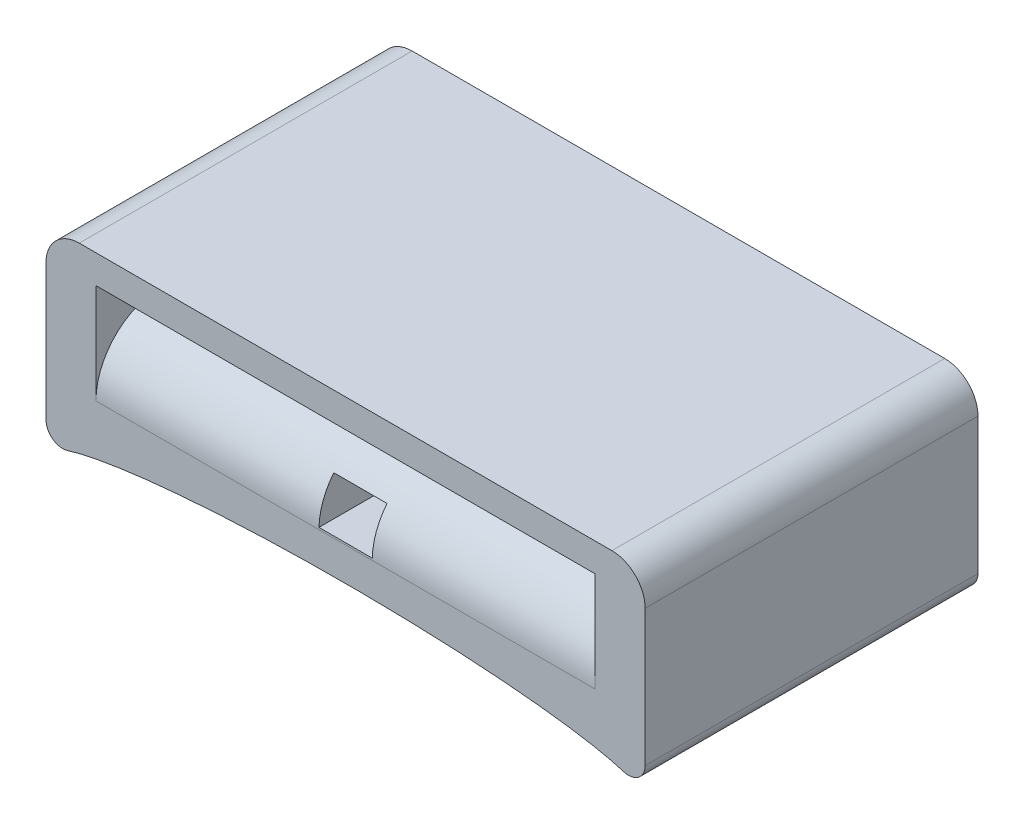
ISO-10303-21;
HEADER;
FILE_DESCRIPTION(('STEP AP214'),'2;1');
FILE_NAME('part.step','',(''),(''),'','','');
FILE_SCHEMA(('AUTOMOTIVE_DESIGN { 1 0 10303 214 1 1 1 1 }'));
ENDSEC;
DATA;
#1=APPLICATION_CONTEXT('core data for automotive mechanical design processes');
#2=APPLICATION_PROTOCOL_DEFINITION('international standard','automotive_design',2000,#1);
#3=PRODUCT_CONTEXT('',#1,'mechanical');
#4=PRODUCT('Part','Part','',(#3));
#5=PRODUCT_RELATED_PRODUCT_CATEGORY('part','',(#4));
#6=PRODUCT_DEFINITION_FORMATION('','',#4);
#7=PRODUCT_DEFINITION_CONTEXT('part definition',#1,'design');
#8=PRODUCT_DEFINITION('design','',#6,#7);
#9=PRODUCT_DEFINITION_SHAPE('','',#8);
#10=(LENGTH_UNIT() NAMED_UNIT(*) SI_UNIT(.MILLI.,.METRE.));
#11=(NAMED_UNIT(*) PLANE_ANGLE_UNIT() SI_UNIT($,.RADIAN.));
#12=(NAMED_UNIT(*) SI_UNIT($,.STERADIAN.) SOLID_ANGLE_UNIT());
#13=UNCERTAINTY_MEASURE_WITH_UNIT(LENGTH_MEASURE(1.E-05),#10,'distance_accuracy_value','');
#14=(GEOMETRIC_REPRESENTATION_CONTEXT(3) GLOBAL_UNCERTAINTY_ASSIGNED_CONTEXT((#13)) GLOBAL_UNIT_ASSIGNED_CONTEXT((#10,
#11,#12)) REPRESENTATION_CONTEXT('',''));
#15=CARTESIAN_POINT('',(0.,0.,0.));
#16=DIRECTION('',(0.,0.,1.));
#17=DIRECTION('',(1.,0.,0.));
#18=AXIS2_PLACEMENT_3D('',#15,#16,#17);
#19=CARTESIAN_POINT('',(-93.7271134300167,3.,36.0605939657694));
#20=DIRECTION('',(0.,0.,-1.));
#21=DIRECTION('',(-1.,0.,0.));
#22=AXIS2_PLACEMENT_3D('',#19,#20,#21);
#23=PLANE('',#22);
#24=DIRECTION('',(-1.,0.,0.));
#25=VECTOR('',#24,1.);
#26=CARTESIAN_POINT('',(-92.9771134300168,1.07272080045992,36.0605939657694));
#27=LINE('',#26,#25);
#28=CARTESIAN_POINT('',(-85.4771134300168,1.07272080045992,36.0605939657694));
#29=VERTEX_POINT('',#28);
#30=CARTESIAN_POINT('',(-92.9771134300168,1.07272080045992,36.0605939657694));
#31=VERTEX_POINT('',#30);
#32=EDGE_CURVE('E202',#29,#31,#27,.T.);
#33=ORIENTED_EDGE('',*,*,#32,.T.);
#34=DIRECTION('',(0.,1.,0.));
#35=VECTOR('',#34,1.);
#36=CARTESIAN_POINT('',(-92.9771134300168,0.,36.0605939657694));
#37=LINE('',#36,#35);
#38=CARTESIAN_POINT('',(-92.9771134300168,2.57272080045992,36.0605939657694));
#39=VERTEX_POINT('',#38);
#40=EDGE_CURVE('E65',#31,#39,#37,.T.);
#41=ORIENTED_EDGE('',*,*,#40,.T.);
#42=DIRECTION('',(-1.,0.,0.));
#43=VECTOR('',#42,1.);
#44=CARTESIAN_POINT('',(0.,2.57272080045992,36.0605939657694));
#45=LINE('',#44,#43);
#46=CARTESIAN_POINT('',(-85.4771134300168,2.57272080045992,36.0605939657694));
#47=VERTEX_POINT('',#46);
#48=EDGE_CURVE('E342',#47,#39,#45,.T.);
#49=ORIENTED_EDGE('',*,*,#48,.F.);
#50=DIRECTION('',(0.,1.,0.));
#51=VECTOR('',#50,1.);
#52=CARTESIAN_POINT('',(-85.4771134300168,0.,36.0605939657694));
#53=LINE('',#52,#51);
#54=EDGE_CURVE('E325',#29,#47,#53,.T.);
#55=ORIENTED_EDGE('',*,*,#54,.F.);
#56=EDGE_LOOP('',(#33,#41,#49,#55));
#57=FACE_BOUND('',#56,.T.);
#58=DIRECTION('',(1.,0.,0.));
#59=VECTOR('',#58,1.);
#60=CARTESIAN_POINT('',(-93.7271134300167,3.,36.0605939657694));
#61=LINE('',#60,#59);
#62=CARTESIAN_POINT('',(-93.2271134300167,3.,36.0605939657694));
#63=VERTEX_POINT('',#62);
#64=CARTESIAN_POINT('',(-85.2271134300168,3.,36.0605939657694));
#65=VERTEX_POINT('',#64);
#66=EDGE_CURVE('E407',#63,#65,#61,.T.);
#67=ORIENTED_EDGE('',*,*,#66,.F.);
#68=CARTESIAN_POINT('',(-93.2271134300167,2.5,36.0605939657694));
#69=DIRECTION('',(0.,0.,-1.));
#70=DIRECTION('',(-1.,0.,0.));
#71=AXIS2_PLACEMENT_3D('',#68,#69,#70);
#72=CIRCLE('',#71,0.5);
#73=CARTESIAN_POINT('',(-93.7271134300167,2.5,36.0605939657694));
#74=VERTEX_POINT('',#73);
#75=EDGE_CURVE('E370',#63,#74,#72,.F.);
#76=ORIENTED_EDGE('',*,*,#75,.T.);
#77=DIRECTION('',(0.,-1.,0.));
#78=VECTOR('',#77,1.);
#79=CARTESIAN_POINT('',(-93.7271134300167,3.,36.0605939657694));
#80=LINE('',#79,#78);
#81=CARTESIAN_POINT('',(-93.7271134300167,0.452186328997408,36.0605939657694));
#82=VERTEX_POINT('',#81);
#83=EDGE_CURVE('E400',#74,#82,#80,.T.);
#84=ORIENTED_EDGE('',*,*,#83,.T.);
#85=CARTESIAN_POINT('',(-93.4771134300167,0.452186328997408,36.0605939657694));
#86=DIRECTION('',(0.,0.,-1.));
#87=DIRECTION('',(-1.,0.,0.));
#88=AXIS2_PLACEMENT_3D('',#85,#86,#87);
#89=CIRCLE('',#88,0.25);
#90=CARTESIAN_POINT('',(-93.4017315918607,0.213821947270138,36.0605939657694));
#91=VERTEX_POINT('',#90);
#92=EDGE_CURVE('E429',#82,#91,#89,.F.);
#93=ORIENTED_EDGE('',*,*,#92,.T.);
#94=CARTESIAN_POINT('',(-89.2271134300167,0.,36.0605939657694));
#95=DIRECTION('',(0.,0.,1.));
#96=DIRECTION('',(1.,0.,0.));
#97=AXIS2_PLACEMENT_3D('',#94,#95,#96);
#98=ELLIPSE('',#97,4.49999999999999,0.572720800459922);
#99=CARTESIAN_POINT('',(-85.0524952681727,0.213821947270138,36.0605939657694));
#100=VERTEX_POINT('',#99);
#101=EDGE_CURVE('E263',#100,#91,#98,.T.);
#102=ORIENTED_EDGE('',*,*,#101,.F.);
#103=CARTESIAN_POINT('',(-84.9771134300168,0.452186328997408,36.0605939657694));
#104=DIRECTION('',(0.,0.,-1.));
#105=DIRECTION('',(-1.,0.,0.));
#106=AXIS2_PLACEMENT_3D('',#103,#104,#105);
#107=CIRCLE('',#106,0.25);
#108=CARTESIAN_POINT('',(-84.7271134300168,0.452186328997409,36.0605939657694));
#109=VERTEX_POINT('',#108);
#110=EDGE_CURVE('E397',#100,#109,#107,.F.);
#111=ORIENTED_EDGE('',*,*,#110,.T.);
#112=DIRECTION('',(0.,-1.,0.));
#113=VECTOR('',#112,1.);
#114=CARTESIAN_POINT('',(-84.7271134300168,3.,36.0605939657694));
#115=LINE('',#114,#113);
#116=CARTESIAN_POINT('',(-84.7271134300168,2.5,36.0605939657694));
#117=VERTEX_POINT('',#116);
#118=EDGE_CURVE('E389',#117,#109,#115,.T.);
#119=ORIENTED_EDGE('',*,*,#118,.F.);
#120=CARTESIAN_POINT('',(-85.2271134300168,2.5,36.0605939657694));
#121=DIRECTION('',(0.,0.,-1.));
#122=DIRECTION('',(-1.,0.,0.));
#123=AXIS2_PLACEMENT_3D('',#120,#121,#122);
#124=CIRCLE('',#123,0.5);
#125=EDGE_CURVE('E367',#117,#65,#124,.F.);
#126=ORIENTED_EDGE('',*,*,#125,.T.);
#127=EDGE_LOOP('',(#67,#76,#84,#93,#102,#111,#119,#126));
#128=FACE_BOUND('',#127,.T.);
#129=ADVANCED_FACE('F45',(#57,#128),#23,.F.);
#130=CARTESIAN_POINT('',(-93.7271134300167,3.,31.0605939657694));
#131=DIRECTION('',(0.,0.,1.));
#132=DIRECTION('',(1.,0.,0.));
#133=AXIS2_PLACEMENT_3D('',#130,#131,#132);
#134=PLANE('',#133);
#135=DIRECTION('',(0.,1.,0.));
#136=VECTOR('',#135,1.);
#137=CARTESIAN_POINT('',(-92.9771134300168,3.,31.0605939657694));
#138=LINE('',#137,#136);
#139=CARTESIAN_POINT('',(-92.9771134300168,1.07272080045992,31.0605939657694));
#140=VERTEX_POINT('',#139);
#141=CARTESIAN_POINT('',(-92.9771134300168,2.57272080045992,31.0605939657694));
#142=VERTEX_POINT('',#141);
#143=EDGE_CURVE('E180',#140,#142,#138,.T.);
#144=ORIENTED_EDGE('',*,*,#143,.F.);
#145=DIRECTION('',(-1.,0.,0.));
#146=VECTOR('',#145,1.);
#147=CARTESIAN_POINT('',(-85.4771134300168,1.07272080045992,31.0605939657694));
#148=LINE('',#147,#146);
#149=CARTESIAN_POINT('',(-85.4771134300168,1.07272080045992,31.0605939657694));
#150=VERTEX_POINT('',#149);
#151=EDGE_CURVE('E186',#140,#150,#148,.F.);
#152=ORIENTED_EDGE('',*,*,#151,.T.);
#153=DIRECTION('',(0.,1.,0.));
#154=VECTOR('',#153,1.);
#155=CARTESIAN_POINT('',(-85.4771134300168,3.,31.0605939657694));
#156=LINE('',#155,#154);
#157=CARTESIAN_POINT('',(-85.4771134300168,2.57272080045992,31.0605939657694));
#158=VERTEX_POINT('',#157);
#159=EDGE_CURVE('E190',#150,#158,#156,.T.);
#160=ORIENTED_EDGE('',*,*,#159,.T.);
#161=DIRECTION('',(-1.,0.,0.));
#162=VECTOR('',#161,1.);
#163=CARTESIAN_POINT('',(-93.7271134300167,2.57272080045992,31.0605939657694));
#164=LINE('',#163,#162);
#165=EDGE_CURVE('E188',#158,#142,#164,.T.);
#166=ORIENTED_EDGE('',*,*,#165,.T.);
#167=EDGE_LOOP('',(#144,#152,#160,#166));
#168=FACE_BOUND('',#167,.T.);
#169=DIRECTION('',(0.,-1.,0.));
#170=VECTOR('',#169,1.);
#171=CARTESIAN_POINT('',(-93.7271134300167,3.,31.0605939657694));
#172=LINE('',#171,#170);
#173=CARTESIAN_POINT('',(-93.7271134300167,2.5,31.0605939657694));
#174=VERTEX_POINT('',#173);
#175=CARTESIAN_POINT('',(-93.7271134300167,0.452186328997408,31.0605939657694));
#176=VERTEX_POINT('',#175);
#177=EDGE_CURVE('E411',#174,#176,#172,.T.);
#178=ORIENTED_EDGE('',*,*,#177,.F.);
#179=CARTESIAN_POINT('',(-93.2271134300167,2.5,31.0605939657694));
#180=DIRECTION('',(0.,0.,1.));
#181=DIRECTION('',(1.,0.,0.));
#182=AXIS2_PLACEMENT_3D('',#179,#180,#181);
#183=CIRCLE('',#182,0.5);
#184=CARTESIAN_POINT('',(-93.2271134300167,3.,31.0605939657694));
#185=VERTEX_POINT('',#184);
#186=EDGE_CURVE('E379',#174,#185,#183,.F.);
#187=ORIENTED_EDGE('',*,*,#186,.T.);
#188=DIRECTION('',(-1.,0.,0.));
#189=VECTOR('',#188,1.);
#190=CARTESIAN_POINT('',(-93.7271134300167,3.,31.0605939657694));
#191=LINE('',#190,#189);
#192=CARTESIAN_POINT('',(-85.2271134300167,3.,31.0605939657694));
#193=VERTEX_POINT('',#192);
#194=EDGE_CURVE('E405',#193,#185,#191,.T.);
#195=ORIENTED_EDGE('',*,*,#194,.F.);
#196=CARTESIAN_POINT('',(-85.2271134300167,2.5,31.0605939657694));
#197=DIRECTION('',(0.,0.,1.));
#198=DIRECTION('',(1.,0.,0.));
#199=AXIS2_PLACEMENT_3D('',#196,#197,#198);
#200=CIRCLE('',#199,0.5);
#201=CARTESIAN_POINT('',(-84.7271134300167,2.5,31.0605939657694));
#202=VERTEX_POINT('',#201);
#203=EDGE_CURVE('E376',#193,#202,#200,.F.);
#204=ORIENTED_EDGE('',*,*,#203,.T.);
#205=DIRECTION('',(0.,-1.,0.));
#206=VECTOR('',#205,1.);
#207=CARTESIAN_POINT('',(-84.7271134300167,3.,31.0605939657694));
#208=LINE('',#207,#206);
#209=CARTESIAN_POINT('',(-84.7271134300167,0.452186328997409,31.0605939657694));
#210=VERTEX_POINT('',#209);
#211=EDGE_CURVE('E391',#202,#210,#208,.T.);
#212=ORIENTED_EDGE('',*,*,#211,.T.);
#213=CARTESIAN_POINT('',(-84.9771134300168,0.452186328997408,31.0605939657694));
#214=DIRECTION('',(0.,0.,1.));
#215=DIRECTION('',(1.,0.,0.));
#216=AXIS2_PLACEMENT_3D('',#213,#214,#215);
#217=CIRCLE('',#216,0.25);
#218=CARTESIAN_POINT('',(-85.0524952681727,0.213821947270138,31.0605939657694));
#219=VERTEX_POINT('',#218);
#220=EDGE_CURVE('E438',#210,#219,#217,.F.);
#221=ORIENTED_EDGE('',*,*,#220,.T.);
#222=CARTESIAN_POINT('',(-89.2271134300167,0.,31.0605939657694));
#223=DIRECTION('',(0.,0.,1.));
#224=DIRECTION('',(1.,0.,0.));
#225=AXIS2_PLACEMENT_3D('',#222,#223,#224);
#226=ELLIPSE('',#225,4.49999999999999,0.572720800459922);
#227=CARTESIAN_POINT('',(-93.4017315918607,0.213821947270138,31.0605939657694));
#228=VERTEX_POINT('',#227);
#229=EDGE_CURVE('E416',#219,#228,#226,.T.);
#230=ORIENTED_EDGE('',*,*,#229,.T.);
#231=CARTESIAN_POINT('',(-93.4771134300167,0.452186328997408,31.0605939657694));
#232=DIRECTION('',(0.,0.,1.));
#233=DIRECTION('',(1.,0.,0.));
#234=AXIS2_PLACEMENT_3D('',#231,#232,#233);
#235=CIRCLE('',#234,0.25);
#236=EDGE_CURVE('E441',#228,#176,#235,.F.);
#237=ORIENTED_EDGE('',*,*,#236,.T.);
#238=EDGE_LOOP('',(#178,#187,#195,#204,#212,#221,#230,#237));
#239=FACE_BOUND('',#238,.T.);
#240=ADVANCED_FACE('F182',(#168,#239),#134,.F.);
#241=CARTESIAN_POINT('',(-93.7271134300167,3.,31.0605939657694));
#242=DIRECTION('',(1.,0.,0.));
#243=DIRECTION('',(0.,0.,-1.));
#244=AXIS2_PLACEMENT_3D('',#241,#242,#243);
#245=PLANE('',#244);
#246=ORIENTED_EDGE('',*,*,#83,.F.);
#247=DIRECTION('',(0.,0.,1.));
#248=VECTOR('',#247,1.);
#249=CARTESIAN_POINT('',(-93.7271134300167,2.5,31.0605939657694));
#250=LINE('',#249,#248);
#251=EDGE_CURVE('E373',#74,#174,#250,.F.);
#252=ORIENTED_EDGE('',*,*,#251,.T.);
#253=ORIENTED_EDGE('',*,*,#177,.T.);
#254=DIRECTION('',(0.,0.,1.));
#255=VECTOR('',#254,1.);
#256=CARTESIAN_POINT('',(-93.7271134300167,0.452186328997408,31.0605939657694));
#257=LINE('',#256,#255);
#258=EDGE_CURVE('E423',#176,#82,#257,.T.);
#259=ORIENTED_EDGE('',*,*,#258,.T.);
#260=EDGE_LOOP('',(#246,#252,#253,#259));
#261=FACE_BOUND('',#260,.T.);
#262=ADVANCED_FACE('F281',(#261),#245,.F.);
#263=CARTESIAN_POINT('',(-84.7271134300167,3.,31.0605939657694));
#264=DIRECTION('',(-1.,0.,0.));
#265=DIRECTION('',(0.,0.,1.));
#266=AXIS2_PLACEMENT_3D('',#263,#264,#265);
#267=PLANE('',#266);
#268=ORIENTED_EDGE('',*,*,#211,.F.);
#269=DIRECTION('',(0.,0.,-1.));
#270=VECTOR('',#269,1.);
#271=CARTESIAN_POINT('',(-84.7271134300168,2.5,36.0605939657694));
#272=LINE('',#271,#270);
#273=EDGE_CURVE('E382',#202,#117,#272,.F.);
#274=ORIENTED_EDGE('',*,*,#273,.T.);
#275=ORIENTED_EDGE('',*,*,#118,.T.);
#276=DIRECTION('',(0.,0.,1.));
#277=VECTOR('',#276,1.);
#278=CARTESIAN_POINT('',(-84.7271134300167,0.452186328997409,31.0605939657694));
#279=LINE('',#278,#277);
#280=EDGE_CURVE('E235',#109,#210,#279,.F.);
#281=ORIENTED_EDGE('',*,*,#280,.T.);
#282=EDGE_LOOP('',(#268,#274,#275,#281));
#283=FACE_BOUND('',#282,.T.);
#284=ADVANCED_FACE('F277',(#283),#267,.F.);
#285=CARTESIAN_POINT('',(0.,3.,0.));
#286=DIRECTION('',(0.,1.,0.));
#287=DIRECTION('',(0.,0.,1.));
#288=AXIS2_PLACEMENT_3D('',#285,#286,#287);
#289=PLANE('',#288);
#290=ORIENTED_EDGE('',*,*,#194,.T.);
#291=DIRECTION('',(0.,0.,1.));
#292=VECTOR('',#291,1.);
#293=CARTESIAN_POINT('',(-93.2271134300167,3.,36.0605939657694));
#294=LINE('',#293,#292);
#295=EDGE_CURVE('E360',#185,#63,#294,.T.);
#296=ORIENTED_EDGE('',*,*,#295,.T.);
#297=ORIENTED_EDGE('',*,*,#66,.T.);
#298=DIRECTION('',(0.,0.,-1.));
#299=VECTOR('',#298,1.);
#300=CARTESIAN_POINT('',(-85.2271134300167,3.,31.0605939657694));
#301=LINE('',#300,#299);
#302=EDGE_CURVE('E356',#65,#193,#301,.T.);
#303=ORIENTED_EDGE('',*,*,#302,.T.);
#304=EDGE_LOOP('',(#290,#296,#297,#303));
#305=FACE_BOUND('',#304,.T.);
#306=ADVANCED_FACE('F271',(#305),#289,.T.);
#307=CARTESIAN_POINT('',(-89.2271134300167,0.,26.0605939657694));
#308=DIRECTION('',(0.,0.,1.));
#309=DIRECTION('',(1.,0.,0.));
#310=AXIS2_PLACEMENT_3D('',#307,#308,#309);
#311=ELLIPSE('',#310,4.49999999999999,0.572720800459922);
#312=DIRECTION('',(0.,0.,1.));
#313=VECTOR('',#312,1.);
#314=SURFACE_OF_LINEAR_EXTRUSION('',#311,#313);
#315=ORIENTED_EDGE('',*,*,#101,.T.);
#316=DIRECTION('',(0.,0.,1.));
#317=VECTOR('',#316,1.);
#318=CARTESIAN_POINT('',(-93.4017315918607,0.213821947270138,36.0605939657694));
#319=LINE('',#318,#317);
#320=EDGE_CURVE('E435',#91,#228,#319,.F.);
#321=ORIENTED_EDGE('',*,*,#320,.T.);
#322=ORIENTED_EDGE('',*,*,#229,.F.);
#323=DIRECTION('',(0.,0.,1.));
#324=VECTOR('',#323,1.);
#325=CARTESIAN_POINT('',(-85.0524952681727,0.213821947270138,31.0605939657694));
#326=LINE('',#325,#324);
#327=EDGE_CURVE('E432',#219,#100,#326,.T.);
#328=ORIENTED_EDGE('',*,*,#327,.T.);
#329=EDGE_LOOP('',(#315,#321,#322,#328));
#330=FACE_BOUND('',#329,.T.);
#331=ADVANCED_FACE('F266',(#330),#314,.F.);
#332=CARTESIAN_POINT('',(-93.4771134300167,0.452186328997408,33.5605939657694));
#333=DIRECTION('',(0.,0.,1.));
#334=DIRECTION('',(1.,0.,0.));
#335=AXIS2_PLACEMENT_3D('',#332,#333,#334);
#336=CYLINDRICAL_SURFACE('',#335,0.25);
#337=ORIENTED_EDGE('',*,*,#236,.F.);
#338=ORIENTED_EDGE('',*,*,#320,.F.);
#339=ORIENTED_EDGE('',*,*,#92,.F.);
#340=ORIENTED_EDGE('',*,*,#258,.F.);
#341=EDGE_LOOP('',(#337,#338,#339,#340));
#342=FACE_BOUND('',#341,.T.);
#343=ADVANCED_FACE('F270',(#342),#336,.T.);
#344=CARTESIAN_POINT('',(-84.9771134300168,0.452186328997408,33.5605939657694));
#345=DIRECTION('',(0.,0.,1.));
#346=DIRECTION('',(1.,0.,0.));
#347=AXIS2_PLACEMENT_3D('',#344,#345,#346);
#348=CYLINDRICAL_SURFACE('',#347,0.25);
#349=ORIENTED_EDGE('',*,*,#110,.F.);
#350=ORIENTED_EDGE('',*,*,#327,.F.);
#351=ORIENTED_EDGE('',*,*,#220,.F.);
#352=ORIENTED_EDGE('',*,*,#280,.F.);
#353=EDGE_LOOP('',(#349,#350,#351,#352));
#354=FACE_BOUND('',#353,.T.);
#355=ADVANCED_FACE('F293',(#354),#348,.T.);
#356=CARTESIAN_POINT('',(-88.8271134300167,0.,26.0605939657694));
#357=DIRECTION('',(-1.,0.,0.));
#358=DIRECTION('',(0.,0.,1.));
#359=AXIS2_PLACEMENT_3D('',#356,#357,#358);
#360=PLANE('',#359);
#361=CARTESIAN_POINT('',(-88.8271134300167,1.07272080045992,32.0605939657694));
#362=DIRECTION('',(-1.,0.,0.));
#363=DIRECTION('',(0.,0.,1.));
#364=AXIS2_PLACEMENT_3D('',#361,#362,#363);
#365=CIRCLE('',#364,1.);
#366=CARTESIAN_POINT('',(-88.8271134300167,1.70221579559036,31.2835894283916));
#367=VERTEX_POINT('',#366);
#368=CARTESIAN_POINT('',(-88.8271134300167,1.10221579559036,31.0610290377821));
#369=VERTEX_POINT('',#368);
#370=EDGE_CURVE('E221',#367,#369,#365,.T.);
#371=ORIENTED_EDGE('',*,*,#370,.T.);
#372=DIRECTION('',(0.,0.,1.));
#373=VECTOR('',#372,1.);
#374=CARTESIAN_POINT('',(-88.8271134300167,1.10221579559036,26.0605939657694));
#375=LINE('',#374,#373);
#376=CARTESIAN_POINT('',(-88.8271134300167,1.10221579559036,36.0601588937567));
#377=VERTEX_POINT('',#376);
#378=EDGE_CURVE('E104',#369,#377,#375,.T.);
#379=ORIENTED_EDGE('',*,*,#378,.T.);
#380=CARTESIAN_POINT('',(-88.8271134300167,1.07272080045992,35.0605939657694));
#381=DIRECTION('',(-1.,0.,0.));
#382=DIRECTION('',(0.,0.,1.));
#383=AXIS2_PLACEMENT_3D('',#380,#381,#382);
#384=CIRCLE('',#383,1.);
#385=CARTESIAN_POINT('',(-88.8271134300167,1.70221579559036,35.8375985031473));
#386=VERTEX_POINT('',#385);
#387=EDGE_CURVE('E236',#386,#377,#384,.F.);
#388=ORIENTED_EDGE('',*,*,#387,.F.);
#389=DIRECTION('',(0.,0.,1.));
#390=VECTOR('',#389,1.);
#391=CARTESIAN_POINT('',(-88.8271134300167,1.70221579559036,26.0605939657694));
#392=LINE('',#391,#390);
#393=EDGE_CURVE('E249',#367,#386,#392,.T.);
#394=ORIENTED_EDGE('',*,*,#393,.F.);
#395=EDGE_LOOP('',(#371,#379,#388,#394));
#396=FACE_BOUND('',#395,.T.);
#397=ADVANCED_FACE('F273',(#396),#360,.T.);
#398=CARTESIAN_POINT('',(0.,1.10221579559036,26.0605939657694));
#399=DIRECTION('',(0.,-1.,0.));
#400=DIRECTION('',(0.,0.,-1.));
#401=AXIS2_PLACEMENT_3D('',#398,#399,#400);
#402=PLANE('',#401);
#403=DIRECTION('',(0.,0.,1.));
#404=VECTOR('',#403,1.);
#405=CARTESIAN_POINT('',(-89.6271134300167,1.10221579559036,26.0605939657694));
#406=LINE('',#405,#404);
#407=CARTESIAN_POINT('',(-89.6271134300167,1.10221579559036,31.0610290377821));
#408=VERTEX_POINT('',#407);
#409=CARTESIAN_POINT('',(-89.6271134300167,1.10221579559036,36.0601588937567));
#410=VERTEX_POINT('',#409);
#411=EDGE_CURVE('E99',#408,#410,#406,.T.);
#412=ORIENTED_EDGE('',*,*,#411,.T.);
#413=DIRECTION('',(1.,0.,0.));
#414=VECTOR('',#413,1.);
#415=CARTESIAN_POINT('',(-89.2271134300167,1.10221579559036,36.0601588937567));
#416=LINE('',#415,#414);
#417=EDGE_CURVE('E49',#410,#377,#416,.T.);
#418=ORIENTED_EDGE('',*,*,#417,.T.);
#419=ORIENTED_EDGE('',*,*,#378,.F.);
#420=DIRECTION('',(1.,0.,0.));
#421=VECTOR('',#420,1.);
#422=CARTESIAN_POINT('',(-89.2271134300167,1.10221579559036,31.0610290377821));
#423=LINE('',#422,#421);
#424=EDGE_CURVE('E224',#408,#369,#423,.T.);
#425=ORIENTED_EDGE('',*,*,#424,.F.);
#426=EDGE_LOOP('',(#412,#418,#419,#425));
#427=FACE_BOUND('',#426,.T.);
#428=ADVANCED_FACE('F321',(#427),#402,.F.);
#429=CARTESIAN_POINT('',(-89.6271134300167,0.,26.0605939657694));
#430=DIRECTION('',(-1.,0.,0.));
#431=DIRECTION('',(0.,0.,1.));
#432=AXIS2_PLACEMENT_3D('',#429,#430,#431);
#433=PLANE('',#432);
#434=DIRECTION('',(0.,0.,1.));
#435=VECTOR('',#434,1.);
#436=CARTESIAN_POINT('',(-89.6271134300167,1.70221579559036,26.0605939657694));
#437=LINE('',#436,#435);
#438=CARTESIAN_POINT('',(-89.6271134300167,1.70221579559036,31.2835894283916));
#439=VERTEX_POINT('',#438);
#440=CARTESIAN_POINT('',(-89.6271134300167,1.70221579559036,35.8375985031473));
#441=VERTEX_POINT('',#440);
#442=EDGE_CURVE('E252',#439,#441,#437,.T.);
#443=ORIENTED_EDGE('',*,*,#442,.T.);
#444=CARTESIAN_POINT('',(-89.6271134300167,1.07272080045992,35.0605939657694));
#445=DIRECTION('',(-1.,0.,0.));
#446=DIRECTION('',(0.,0.,1.));
#447=AXIS2_PLACEMENT_3D('',#444,#445,#446);
#448=CIRCLE('',#447,1.);
#449=EDGE_CURVE('E243',#441,#410,#448,.F.);
#450=ORIENTED_EDGE('',*,*,#449,.T.);
#451=ORIENTED_EDGE('',*,*,#411,.F.);
#452=CARTESIAN_POINT('',(-89.6271134300167,1.07272080045992,32.0605939657694));
#453=DIRECTION('',(-1.,0.,0.));
#454=DIRECTION('',(0.,0.,1.));
#455=AXIS2_PLACEMENT_3D('',#452,#453,#454);
#456=CIRCLE('',#455,1.);
#457=EDGE_CURVE('E228',#439,#408,#456,.T.);
#458=ORIENTED_EDGE('',*,*,#457,.F.);
#459=EDGE_LOOP('',(#443,#450,#451,#458));
#460=FACE_BOUND('',#459,.T.);
#461=ADVANCED_FACE('F322',(#460),#433,.F.);
#462=CARTESIAN_POINT('',(0.,1.70221579559036,26.0605939657694));
#463=DIRECTION('',(0.,-1.,0.));
#464=DIRECTION('',(0.,0.,-1.));
#465=AXIS2_PLACEMENT_3D('',#462,#463,#464);
#466=PLANE('',#465);
#467=DIRECTION('',(1.,0.,0.));
#468=VECTOR('',#467,1.);
#469=CARTESIAN_POINT('',(-89.2271134300167,1.70221579559036,31.2835894283916));
#470=LINE('',#469,#468);
#471=EDGE_CURVE('E232',#439,#367,#470,.T.);
#472=ORIENTED_EDGE('',*,*,#471,.T.);
#473=ORIENTED_EDGE('',*,*,#393,.T.);
#474=DIRECTION('',(1.,0.,0.));
#475=VECTOR('',#474,1.);
#476=CARTESIAN_POINT('',(-89.2271134300167,1.70221579559036,35.8375985031473));
#477=LINE('',#476,#475);
#478=EDGE_CURVE('E240',#441,#386,#477,.T.);
#479=ORIENTED_EDGE('',*,*,#478,.F.);
#480=ORIENTED_EDGE('',*,*,#442,.F.);
#481=EDGE_LOOP('',(#472,#473,#479,#480));
#482=FACE_BOUND('',#481,.T.);
#483=ADVANCED_FACE('F466',(#482),#466,.T.);
#484=CARTESIAN_POINT('',(-85.4771134300168,0.,26.0605939657694));
#485=DIRECTION('',(1.,0.,0.));
#486=DIRECTION('',(0.,0.,-1.));
#487=AXIS2_PLACEMENT_3D('',#484,#485,#486);
#488=PLANE('',#487);
#489=ORIENTED_EDGE('',*,*,#159,.F.);
#490=CARTESIAN_POINT('',(-85.4771134300168,1.07272080045992,32.0605939657694));
#491=DIRECTION('',(1.,0.,0.));
#492=DIRECTION('',(0.,0.,-1.));
#493=AXIS2_PLACEMENT_3D('',#490,#491,#492);
#494=CIRCLE('',#493,1.);
#495=CARTESIAN_POINT('',(-85.4771134300168,2.07272080045992,32.0605939657694));
#496=VERTEX_POINT('',#495);
#497=EDGE_CURVE('E201',#150,#496,#494,.T.);
#498=ORIENTED_EDGE('',*,*,#497,.T.);
#499=DIRECTION('',(0.,0.,1.));
#500=VECTOR('',#499,1.);
#501=CARTESIAN_POINT('',(-85.4771134300168,2.07272080045992,26.0605939657694));
#502=LINE('',#501,#500);
#503=CARTESIAN_POINT('',(-85.4771134300168,2.07272080045992,35.0605939657694));
#504=VERTEX_POINT('',#503);
#505=EDGE_CURVE('E336',#496,#504,#502,.T.);
#506=ORIENTED_EDGE('',*,*,#505,.T.);
#507=CARTESIAN_POINT('',(-85.4771134300168,1.07272080045992,35.0605939657694));
#508=DIRECTION('',(1.,0.,0.));
#509=DIRECTION('',(0.,0.,-1.));
#510=AXIS2_PLACEMENT_3D('',#507,#508,#509);
#511=CIRCLE('',#510,1.);
#512=EDGE_CURVE('E11',#504,#29,#511,.T.);
#513=ORIENTED_EDGE('',*,*,#512,.T.);
#514=ORIENTED_EDGE('',*,*,#54,.T.);
#515=DIRECTION('',(0.,0.,1.));
#516=VECTOR('',#515,1.);
#517=CARTESIAN_POINT('',(-85.4771134300168,2.57272080045992,26.0605939657694));
#518=LINE('',#517,#516);
#519=EDGE_CURVE('E328',#158,#47,#518,.T.);
#520=ORIENTED_EDGE('',*,*,#519,.F.);
#521=EDGE_LOOP('',(#489,#498,#506,#513,#514,#520));
#522=FACE_BOUND('',#521,.T.);
#523=ADVANCED_FACE('F348',(#522),#488,.F.);
#524=CARTESIAN_POINT('',(0.,2.07272080045993,26.0605939657694));
#525=DIRECTION('',(0.,1.,0.));
#526=DIRECTION('',(-1.,0.,0.));
#527=AXIS2_PLACEMENT_3D('',#524,#525,#526);
#528=PLANE('',#527);
#529=ORIENTED_EDGE('',*,*,#505,.F.);
#530=DIRECTION('',(-1.,0.,0.));
#531=VECTOR('',#530,1.);
#532=CARTESIAN_POINT('',(-92.9771134300168,2.07272080045992,32.0605939657694));
#533=LINE('',#532,#531);
#534=CARTESIAN_POINT('',(-92.9771134300168,2.07272080045992,32.0605939657694));
#535=VERTEX_POINT('',#534);
#536=EDGE_CURVE('E207',#496,#535,#533,.T.);
#537=ORIENTED_EDGE('',*,*,#536,.T.);
#538=DIRECTION('',(0.,0.,1.));
#539=VECTOR('',#538,1.);
#540=CARTESIAN_POINT('',(-92.9771134300168,2.07272080045992,26.0605939657694));
#541=LINE('',#540,#539);
#542=CARTESIAN_POINT('',(-92.9771134300168,2.07272080045992,35.0605939657694));
#543=VERTEX_POINT('',#542);
#544=EDGE_CURVE('E196',#535,#543,#541,.T.);
#545=ORIENTED_EDGE('',*,*,#544,.T.);
#546=DIRECTION('',(-1.,0.,0.));
#547=VECTOR('',#546,1.);
#548=CARTESIAN_POINT('',(-85.4771134300168,2.07272080045992,35.0605939657694));
#549=LINE('',#548,#547);
#550=EDGE_CURVE('E213',#543,#504,#549,.F.);
#551=ORIENTED_EDGE('',*,*,#550,.T.);
#552=EDGE_LOOP('',(#529,#537,#545,#551));
#553=FACE_BOUND('',#552,.T.);
#554=ADVANCED_FACE('F354',(#553),#528,.T.);
#555=CARTESIAN_POINT('',(-92.9771134300168,0.,26.0605939657694));
#556=DIRECTION('',(1.,0.,0.));
#557=DIRECTION('',(0.,0.,-1.));
#558=AXIS2_PLACEMENT_3D('',#555,#556,#557);
#559=PLANE('',#558);
#560=ORIENTED_EDGE('',*,*,#143,.T.);
#561=DIRECTION('',(0.,0.,1.));
#562=VECTOR('',#561,1.);
#563=CARTESIAN_POINT('',(-92.9771134300168,2.57272080045992,26.0605939657694));
#564=LINE('',#563,#562);
#565=EDGE_CURVE('E108',#142,#39,#564,.T.);
#566=ORIENTED_EDGE('',*,*,#565,.T.);
#567=ORIENTED_EDGE('',*,*,#40,.F.);
#568=CARTESIAN_POINT('',(-92.9771134300168,1.07272080045992,35.0605939657694));
#569=DIRECTION('',(1.,0.,0.));
#570=DIRECTION('',(0.,0.,-1.));
#571=AXIS2_PLACEMENT_3D('',#568,#569,#570);
#572=CIRCLE('',#571,1.);
#573=EDGE_CURVE('E56',#31,#543,#572,.F.);
#574=ORIENTED_EDGE('',*,*,#573,.T.);
#575=ORIENTED_EDGE('',*,*,#544,.F.);
#576=CARTESIAN_POINT('',(-92.9771134300168,1.07272080045992,32.0605939657694));
#577=DIRECTION('',(1.,0.,0.));
#578=DIRECTION('',(0.,0.,-1.));
#579=AXIS2_PLACEMENT_3D('',#576,#577,#578);
#580=CIRCLE('',#579,1.);
#581=EDGE_CURVE('E193',#535,#140,#580,.F.);
#582=ORIENTED_EDGE('',*,*,#581,.T.);
#583=EDGE_LOOP('',(#560,#566,#567,#574,#575,#582));
#584=FACE_BOUND('',#583,.T.);
#585=ADVANCED_FACE('F194',(#584),#559,.T.);
#586=CARTESIAN_POINT('',(0.,2.57272080045992,26.0605939657694));
#587=DIRECTION('',(0.,1.,0.));
#588=DIRECTION('',(0.,0.,1.));
#589=AXIS2_PLACEMENT_3D('',#586,#587,#588);
#590=PLANE('',#589);
#591=ORIENTED_EDGE('',*,*,#519,.T.);
#592=ORIENTED_EDGE('',*,*,#48,.T.);
#593=ORIENTED_EDGE('',*,*,#565,.F.);
#594=ORIENTED_EDGE('',*,*,#165,.F.);
#595=EDGE_LOOP('',(#591,#592,#593,#594));
#596=FACE_BOUND('',#595,.T.);
#597=ADVANCED_FACE('F302',(#596),#590,.F.);
#598=CARTESIAN_POINT('',(-93.2271134300167,2.5,0.));
#599=DIRECTION('',(0.,0.,-1.));
#600=DIRECTION('',(-1.,0.,0.));
#601=AXIS2_PLACEMENT_3D('',#598,#599,#600);
#602=CYLINDRICAL_SURFACE('',#601,0.5);
#603=ORIENTED_EDGE('',*,*,#186,.F.);
#604=ORIENTED_EDGE('',*,*,#251,.F.);
#605=ORIENTED_EDGE('',*,*,#75,.F.);
#606=ORIENTED_EDGE('',*,*,#295,.F.);
#607=EDGE_LOOP('',(#603,#604,#605,#606));
#608=FACE_BOUND('',#607,.T.);
#609=ADVANCED_FACE('F298',(#608),#602,.T.);
#610=CARTESIAN_POINT('',(-85.2271134300167,2.5,-2.36552759130861E-13));
#611=DIRECTION('',(0.,0.,1.));
#612=DIRECTION('',(1.,0.,0.));
#613=AXIS2_PLACEMENT_3D('',#610,#611,#612);
#614=CYLINDRICAL_SURFACE('',#613,0.5);
#615=ORIENTED_EDGE('',*,*,#125,.F.);
#616=ORIENTED_EDGE('',*,*,#273,.F.);
#617=ORIENTED_EDGE('',*,*,#203,.F.);
#618=ORIENTED_EDGE('',*,*,#302,.F.);
#619=EDGE_LOOP('',(#615,#616,#617,#618));
#620=FACE_BOUND('',#619,.T.);
#621=ADVANCED_FACE('F301',(#620),#614,.T.);
#622=CARTESIAN_POINT('',(0.,1.07272080045993,32.0605939657694));
#623=DIRECTION('',(1.,0.,0.));
#624=DIRECTION('',(0.,1.,0.));
#625=AXIS2_PLACEMENT_3D('',#622,#623,#624);
#626=CYLINDRICAL_SURFACE('',#625,1.);
#627=ORIENTED_EDGE('',*,*,#497,.F.);
#628=ORIENTED_EDGE('',*,*,#151,.F.);
#629=ORIENTED_EDGE('',*,*,#581,.F.);
#630=ORIENTED_EDGE('',*,*,#536,.F.);
#631=EDGE_LOOP('',(#627,#628,#629,#630));
#632=FACE_BOUND('',#631,.T.);
#633=ORIENTED_EDGE('',*,*,#370,.F.);
#634=ORIENTED_EDGE('',*,*,#471,.F.);
#635=ORIENTED_EDGE('',*,*,#457,.T.);
#636=ORIENTED_EDGE('',*,*,#424,.T.);
#637=EDGE_LOOP('',(#633,#634,#635,#636));
#638=FACE_BOUND('',#637,.T.);
#639=ADVANCED_FACE('F204',(#632,#638),#626,.T.);
#640=CARTESIAN_POINT('',(-93.7271134300167,1.07272080045992,35.0605939657694));
#641=DIRECTION('',(1.,0.,0.));
#642=DIRECTION('',(0.,1.,0.));
#643=AXIS2_PLACEMENT_3D('',#640,#641,#642);
#644=CYLINDRICAL_SURFACE('',#643,1.);
#645=ORIENTED_EDGE('',*,*,#512,.F.);
#646=ORIENTED_EDGE('',*,*,#550,.F.);
#647=ORIENTED_EDGE('',*,*,#573,.F.);
#648=ORIENTED_EDGE('',*,*,#32,.F.);
#649=EDGE_LOOP('',(#645,#646,#647,#648));
#650=FACE_BOUND('',#649,.T.);
#651=ORIENTED_EDGE('',*,*,#387,.T.);
#652=ORIENTED_EDGE('',*,*,#417,.F.);
#653=ORIENTED_EDGE('',*,*,#449,.F.);
#654=ORIENTED_EDGE('',*,*,#478,.T.);
#655=EDGE_LOOP('',(#651,#652,#653,#654));
#656=FACE_BOUND('',#655,.T.);
#657=ADVANCED_FACE('F47',(#650,#656),#644,.T.);
#658=CLOSED_SHELL('',(#129,#240,#262,#284,#306,#331,#343,#355,#397,#428,#461,#483,#523,#554,
#585,#597,#609,#621,#639,#657));
#659=MANIFOLD_SOLID_BREP('B2',#658);
#660=ADVANCED_BREP_SHAPE_REPRESENTATION('',(#18,#659),#14);
#661=SHAPE_DEFINITION_REPRESENTATION(#9,#660);
ENDSEC;
END-ISO-10303-21;
